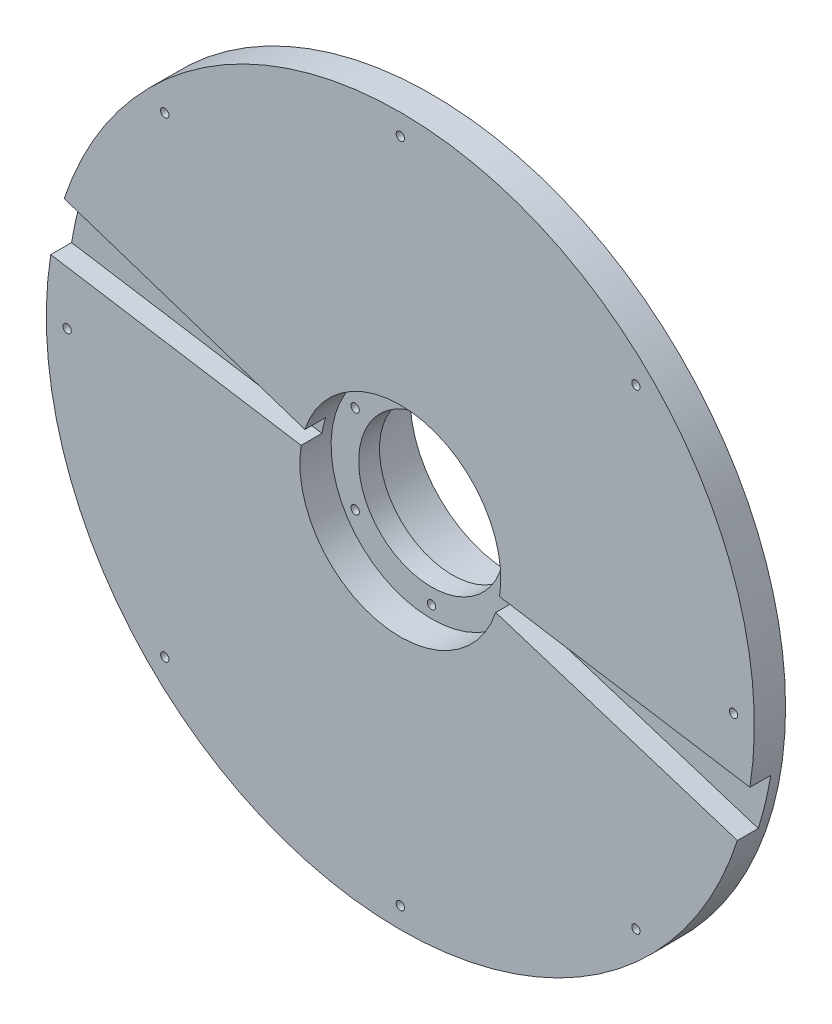
ISO-10303-21;
HEADER;
FILE_DESCRIPTION(('STEP AP214'),'2;1');
FILE_NAME('part.step','',(''),(''),'','','');
FILE_SCHEMA(('AUTOMOTIVE_DESIGN { 1 0 10303 214 1 1 1 1 }'));
ENDSEC;
DATA;
#1=APPLICATION_CONTEXT('core data for automotive mechanical design processes');
#2=APPLICATION_PROTOCOL_DEFINITION('international standard','automotive_design',2000,#1);
#3=PRODUCT_CONTEXT('',#1,'mechanical');
#4=PRODUCT('Part','Part','',(#3));
#5=PRODUCT_RELATED_PRODUCT_CATEGORY('part','',(#4));
#6=PRODUCT_DEFINITION_FORMATION('','',#4);
#7=PRODUCT_DEFINITION_CONTEXT('part definition',#1,'design');
#8=PRODUCT_DEFINITION('design','',#6,#7);
#9=PRODUCT_DEFINITION_SHAPE('','',#8);
#10=(LENGTH_UNIT() NAMED_UNIT(*) SI_UNIT(.MILLI.,.METRE.));
#11=(NAMED_UNIT(*) PLANE_ANGLE_UNIT() SI_UNIT($,.RADIAN.));
#12=(NAMED_UNIT(*) SI_UNIT($,.STERADIAN.) SOLID_ANGLE_UNIT());
#13=UNCERTAINTY_MEASURE_WITH_UNIT(LENGTH_MEASURE(1.E-05),#10,'distance_accuracy_value','');
#14=(GEOMETRIC_REPRESENTATION_CONTEXT(3) GLOBAL_UNCERTAINTY_ASSIGNED_CONTEXT((#13)) GLOBAL_UNIT_ASSIGNED_CONTEXT((#10,
#11,#12)) REPRESENTATION_CONTEXT('',''));
#15=CARTESIAN_POINT('',(0.,0.,0.));
#16=DIRECTION('',(0.,0.,1.));
#17=DIRECTION('',(1.,0.,0.));
#18=AXIS2_PLACEMENT_3D('',#15,#16,#17);
#19=CARTESIAN_POINT('',(0.,0.,53.));
#20=DIRECTION('',(0.,0.,1.));
#21=DIRECTION('',(1.,0.,0.));
#22=AXIS2_PLACEMENT_3D('',#19,#20,#21);
#23=PLANE('',#22);
#24=DIRECTION('',(-0.987467828834262,0.157820426489564,0.));
#25=VECTOR('',#24,1.);
#26=CARTESIAN_POINT('',(47.6453227412532,-7.61483557812152,53.));
#27=LINE('',#26,#25);
#28=CARTESIAN_POINT('',(167.869530901825,-26.8294725032259,53.));
#29=VERTEX_POINT('',#28);
#30=CARTESIAN_POINT('',(47.6453227412532,-7.61483557812152,53.));
#31=VERTEX_POINT('',#30);
#32=EDGE_CURVE('E128',#29,#31,#27,.T.);
#33=ORIENTED_EDGE('',*,*,#32,.F.);
#34=CARTESIAN_POINT('',(0.,0.,53.));
#35=DIRECTION('',(0.,0.,1.));
#36=DIRECTION('',(1.,0.,0.));
#37=AXIS2_PLACEMENT_3D('',#34,#35,#36);
#38=CIRCLE('',#37,170.);
#39=CARTESIAN_POINT('',(-161.405592188564,53.3688561827877,53.));
#40=VERTEX_POINT('',#39);
#41=EDGE_CURVE('E250',#29,#40,#38,.T.);
#42=ORIENTED_EDGE('',*,*,#41,.T.);
#43=DIRECTION('',(-0.949444659932734,0.313934448134027,0.));
#44=VECTOR('',#43,1.);
#45=CARTESIAN_POINT('',(-45.8107048417534,15.1473371224699,53.));
#46=LINE('',#45,#44);
#47=CARTESIAN_POINT('',(-45.8107048417534,15.1473371224699,53.));
#48=VERTEX_POINT('',#47);
#49=EDGE_CURVE('E161',#48,#40,#46,.T.);
#50=ORIENTED_EDGE('',*,*,#49,.F.);
#51=CARTESIAN_POINT('',(0.,0.,53.));
#52=DIRECTION('',(0.,0.,1.));
#53=DIRECTION('',(1.,0.,0.));
#54=AXIS2_PLACEMENT_3D('',#51,#52,#53);
#55=CIRCLE('',#54,48.25);
#56=EDGE_CURVE('E243',#31,#48,#55,.T.);
#57=ORIENTED_EDGE('',*,*,#56,.F.);
#58=EDGE_LOOP('',(#33,#42,#50,#57));
#59=FACE_BOUND('',#58,.T.);
#60=CARTESIAN_POINT('',(0.,160.,53.));
#61=DIRECTION('',(0.,0.,-1.));
#62=DIRECTION('',(-1.,0.,0.));
#63=AXIS2_PLACEMENT_3D('',#60,#61,#62);
#64=CIRCLE('',#63,2.);
#65=CARTESIAN_POINT('',(-2.,160.,53.));
#66=VERTEX_POINT('',#65);
#67=EDGE_CURVE('E235',#66,#66,#64,.T.);
#68=ORIENTED_EDGE('',*,*,#67,.T.);
#69=EDGE_LOOP('',(#68));
#70=FACE_BOUND('',#69,.T.);
#71=CARTESIAN_POINT('',(-113.137084989848,113.137084989847,53.));
#72=DIRECTION('',(0.,0.,-1.));
#73=DIRECTION('',(-0.707106781186546,-0.707106781186549,0.));
#74=AXIS2_PLACEMENT_3D('',#71,#72,#73);
#75=CIRCLE('',#74,2.);
#76=CARTESIAN_POINT('',(-114.551298552221,111.722871427474,53.));
#77=VERTEX_POINT('',#76);
#78=EDGE_CURVE('E227',#77,#77,#75,.T.);
#79=ORIENTED_EDGE('',*,*,#78,.T.);
#80=EDGE_LOOP('',(#79));
#81=FACE_BOUND('',#80,.T.);
#82=CARTESIAN_POINT('',(113.137084989846,113.137084989849,53.));
#83=DIRECTION('',(0.,0.,-1.));
#84=DIRECTION('',(-0.707106781186556,0.707106781186539,0.));
#85=AXIS2_PLACEMENT_3D('',#82,#83,#84);
#86=CIRCLE('',#85,2.);
#87=CARTESIAN_POINT('',(111.722871427473,114.551298552222,53.));
#88=VERTEX_POINT('',#87);
#89=EDGE_CURVE('E186',#88,#88,#86,.T.);
#90=ORIENTED_EDGE('',*,*,#89,.T.);
#91=EDGE_LOOP('',(#90));
#92=FACE_BOUND('',#91,.T.);
#93=CARTESIAN_POINT('',(160.,1.6759110426447E-12,53.));
#94=DIRECTION('',(0.,0.,-1.));
#95=DIRECTION('',(0.,1.,0.));
#96=AXIS2_PLACEMENT_3D('',#93,#94,#95);
#97=CIRCLE('',#96,2.);
#98=CARTESIAN_POINT('',(160.,2.00000000000168,53.));
#99=VERTEX_POINT('',#98);
#100=EDGE_CURVE('E177',#99,#99,#97,.T.);
#101=ORIENTED_EDGE('',*,*,#100,.T.);
#102=EDGE_LOOP('',(#101));
#103=FACE_BOUND('',#102,.T.);
#104=ADVANCED_FACE('F42',(#59,#70,#81,#92,#103),#23,.T.);
#105=CARTESIAN_POINT('',(0.,0.,38.));
#106=DIRECTION('',(0.,0.,1.));
#107=DIRECTION('',(1.,0.,0.));
#108=AXIS2_PLACEMENT_3D('',#105,#106,#107);
#109=PLANE('',#108);
#110=CARTESIAN_POINT('',(0.,0.,38.));
#111=DIRECTION('',(0.,0.,1.));
#112=DIRECTION('',(1.,0.,0.));
#113=AXIS2_PLACEMENT_3D('',#110,#111,#112);
#114=CIRCLE('',#113,35.);
#115=CARTESIAN_POINT('',(35.,0.,38.));
#116=VERTEX_POINT('',#115);
#117=EDGE_CURVE('E285',#116,#116,#114,.T.);
#118=ORIENTED_EDGE('',*,*,#117,.F.);
#119=EDGE_LOOP('',(#118));
#120=FACE_BOUND('',#119,.T.);
#121=CARTESIAN_POINT('',(0.,42.3567380238423,38.));
#122=DIRECTION('',(0.,0.,1.));
#123=DIRECTION('',(1.,0.,0.));
#124=AXIS2_PLACEMENT_3D('',#121,#122,#123);
#125=CIRCLE('',#124,2.);
#126=CARTESIAN_POINT('',(2.,42.3567380238423,38.));
#127=VERTEX_POINT('',#126);
#128=EDGE_CURVE('E280',#127,#127,#125,.T.);
#129=ORIENTED_EDGE('',*,*,#128,.F.);
#130=EDGE_LOOP('',(#129));
#131=FACE_BOUND('',#130,.T.);
#132=CARTESIAN_POINT('',(-36.6820111500898,21.1783690119211,38.));
#133=DIRECTION('',(0.,0.,1.));
#134=DIRECTION('',(0.499999999999998,0.86602540378444,0.));
#135=AXIS2_PLACEMENT_3D('',#132,#133,#134);
#136=CIRCLE('',#135,2.);
#137=CARTESIAN_POINT('',(-35.6820111500898,22.91041981949,38.));
#138=VERTEX_POINT('',#137);
#139=EDGE_CURVE('E263',#138,#138,#136,.T.);
#140=ORIENTED_EDGE('',*,*,#139,.F.);
#141=EDGE_LOOP('',(#140));
#142=FACE_BOUND('',#141,.T.);
#143=CARTESIAN_POINT('',(-36.6820111500896,-21.1783690119213,38.));
#144=DIRECTION('',(0.,0.,1.));
#145=DIRECTION('',(-0.500000000000004,0.866025403784436,0.));
#146=AXIS2_PLACEMENT_3D('',#143,#144,#145);
#147=CIRCLE('',#146,2.);
#148=CARTESIAN_POINT('',(-37.6820111500896,-19.4463182043525,38.));
#149=VERTEX_POINT('',#148);
#150=EDGE_CURVE('E259',#149,#149,#147,.T.);
#151=ORIENTED_EDGE('',*,*,#150,.F.);
#152=EDGE_LOOP('',(#151));
#153=FACE_BOUND('',#152,.T.);
#154=CARTESIAN_POINT('',(0.,-42.3567380238423,38.));
#155=DIRECTION('',(0.,0.,1.));
#156=DIRECTION('',(-1.,0.,0.));
#157=AXIS2_PLACEMENT_3D('',#154,#155,#156);
#158=CIRCLE('',#157,2.);
#159=CARTESIAN_POINT('',(-2.,-42.3567380238423,38.));
#160=VERTEX_POINT('',#159);
#161=EDGE_CURVE('E264',#160,#160,#158,.T.);
#162=ORIENTED_EDGE('',*,*,#161,.F.);
#163=EDGE_LOOP('',(#162));
#164=FACE_BOUND('',#163,.T.);
#165=CARTESIAN_POINT('',(36.6820111500899,-21.1783690119208,38.));
#166=DIRECTION('',(0.,0.,1.));
#167=DIRECTION('',(-0.499999999999992,-0.866025403784443,0.));
#168=AXIS2_PLACEMENT_3D('',#165,#166,#167);
#169=CIRCLE('',#168,2.);
#170=CARTESIAN_POINT('',(35.6820111500899,-22.9104198194897,38.));
#171=VERTEX_POINT('',#170);
#172=EDGE_CURVE('E268',#171,#171,#169,.T.);
#173=ORIENTED_EDGE('',*,*,#172,.F.);
#174=EDGE_LOOP('',(#173));
#175=FACE_BOUND('',#174,.T.);
#176=CARTESIAN_POINT('',(36.6820111500895,21.1783690119216,38.));
#177=DIRECTION('',(0.,0.,1.));
#178=DIRECTION('',(0.50000000000001,-0.866025403784433,0.));
#179=AXIS2_PLACEMENT_3D('',#176,#177,#178);
#180=CIRCLE('',#179,2.);
#181=CARTESIAN_POINT('',(37.6820111500895,19.4463182043527,38.));
#182=VERTEX_POINT('',#181);
#183=EDGE_CURVE('E272',#182,#182,#180,.T.);
#184=ORIENTED_EDGE('',*,*,#183,.F.);
#185=EDGE_LOOP('',(#184));
#186=FACE_BOUND('',#185,.T.);
#187=CARTESIAN_POINT('',(0.,0.,38.));
#188=DIRECTION('',(0.,0.,1.));
#189=DIRECTION('',(1.,0.,0.));
#190=AXIS2_PLACEMENT_3D('',#187,#188,#189);
#191=CIRCLE('',#190,48.25);
#192=CARTESIAN_POINT('',(48.25,0.,38.));
#193=VERTEX_POINT('',#192);
#194=EDGE_CURVE('E239',#193,#193,#191,.T.);
#195=ORIENTED_EDGE('',*,*,#194,.T.);
#196=EDGE_LOOP('',(#195));
#197=FACE_BOUND('',#196,.T.);
#198=ADVANCED_FACE('F355',(#120,#131,#142,#153,#164,#175,#186,#197),#109,.T.);
#199=CARTESIAN_POINT('',(0.,0.,28.));
#200=DIRECTION('',(0.,0.,-1.));
#201=DIRECTION('',(-1.,0.,0.));
#202=AXIS2_PLACEMENT_3D('',#199,#200,#201);
#203=CYLINDRICAL_SURFACE('',#202,60.);
#204=CARTESIAN_POINT('',(0.,0.,28.));
#205=DIRECTION('',(0.,0.,1.));
#206=DIRECTION('',(1.,0.,0.));
#207=AXIS2_PLACEMENT_3D('',#204,#205,#206);
#208=CIRCLE('',#207,60.);
#209=CARTESIAN_POINT('',(60.,0.,28.));
#210=VERTEX_POINT('',#209);
#211=EDGE_CURVE('E11',#210,#210,#208,.T.);
#212=ORIENTED_EDGE('',*,*,#211,.F.);
#213=EDGE_LOOP('',(#212));
#214=FACE_BOUND('',#213,.T.);
#215=CARTESIAN_POINT('',(0.,0.,0.));
#216=DIRECTION('',(0.,0.,1.));
#217=DIRECTION('',(1.,0.,0.));
#218=AXIS2_PLACEMENT_3D('',#215,#216,#217);
#219=CIRCLE('',#218,60.);
#220=CARTESIAN_POINT('',(60.,0.,0.));
#221=VERTEX_POINT('',#220);
#222=EDGE_CURVE('E52',#221,#221,#219,.T.);
#223=ORIENTED_EDGE('',*,*,#222,.T.);
#224=EDGE_LOOP('',(#223));
#225=FACE_BOUND('',#224,.T.);
#226=ADVANCED_FACE('F44',(#214,#225),#203,.T.);
#227=CARTESIAN_POINT('',(0.,0.,0.));
#228=DIRECTION('',(0.,0.,1.));
#229=DIRECTION('',(1.,0.,0.));
#230=AXIS2_PLACEMENT_3D('',#227,#228,#229);
#231=PLANE('',#230);
#232=CARTESIAN_POINT('',(0.,0.,0.));
#233=DIRECTION('',(0.,0.,1.));
#234=DIRECTION('',(1.,0.,0.));
#235=AXIS2_PLACEMENT_3D('',#232,#233,#234);
#236=CIRCLE('',#235,48.25);
#237=CARTESIAN_POINT('',(48.25,0.,0.));
#238=VERTEX_POINT('',#237);
#239=EDGE_CURVE('E299',#238,#238,#236,.T.);
#240=ORIENTED_EDGE('',*,*,#239,.T.);
#241=EDGE_LOOP('',(#240));
#242=FACE_BOUND('',#241,.T.);
#243=ORIENTED_EDGE('',*,*,#222,.F.);
#244=EDGE_LOOP('',(#243));
#245=FACE_BOUND('',#244,.T.);
#246=ADVANCED_FACE('F420',(#242,#245),#231,.F.);
#247=CARTESIAN_POINT('',(0.,0.,0.));
#248=DIRECTION('',(0.,0.,1.));
#249=DIRECTION('',(1.,0.,0.));
#250=AXIS2_PLACEMENT_3D('',#247,#248,#249);
#251=CYLINDRICAL_SURFACE('',#250,48.25);
#252=ORIENTED_EDGE('',*,*,#239,.F.);
#253=EDGE_LOOP('',(#252));
#254=FACE_BOUND('',#253,.T.);
#255=CARTESIAN_POINT('',(0.,0.,28.));
#256=DIRECTION('',(0.,0.,1.));
#257=DIRECTION('',(1.,0.,0.));
#258=AXIS2_PLACEMENT_3D('',#255,#256,#257);
#259=CIRCLE('',#258,48.25);
#260=CARTESIAN_POINT('',(48.25,0.,28.));
#261=VERTEX_POINT('',#260);
#262=EDGE_CURVE('E294',#261,#261,#259,.T.);
#263=ORIENTED_EDGE('',*,*,#262,.T.);
#264=EDGE_LOOP('',(#263));
#265=FACE_BOUND('',#264,.T.);
#266=ADVANCED_FACE('F414',(#254,#265),#251,.F.);
#267=CARTESIAN_POINT('',(0.,0.,28.));
#268=DIRECTION('',(0.,0.,1.));
#269=DIRECTION('',(1.,0.,0.));
#270=AXIS2_PLACEMENT_3D('',#267,#268,#269);
#271=PLANE('',#270);
#272=ORIENTED_EDGE('',*,*,#211,.T.);
#273=EDGE_LOOP('',(#272));
#274=FACE_BOUND('',#273,.T.);
#275=CARTESIAN_POINT('',(0.,0.,28.));
#276=DIRECTION('',(0.,0.,1.));
#277=DIRECTION('',(1.,0.,0.));
#278=AXIS2_PLACEMENT_3D('',#275,#276,#277);
#279=CIRCLE('',#278,150.);
#280=CARTESIAN_POINT('',(150.,0.,28.));
#281=VERTEX_POINT('',#280);
#282=EDGE_CURVE('E295',#281,#281,#279,.T.);
#283=ORIENTED_EDGE('',*,*,#282,.F.);
#284=EDGE_LOOP('',(#283));
#285=FACE_BOUND('',#284,.T.);
#286=ADVANCED_FACE('F409',(#274,#285),#271,.F.);
#287=CARTESIAN_POINT('',(0.,0.,38.));
#288=DIRECTION('',(0.,0.,-1.));
#289=DIRECTION('',(-1.,0.,0.));
#290=AXIS2_PLACEMENT_3D('',#287,#288,#289);
#291=CYLINDRICAL_SURFACE('',#290,150.);
#292=CARTESIAN_POINT('',(0.,0.,38.));
#293=DIRECTION('',(0.,0.,1.));
#294=DIRECTION('',(1.,0.,0.));
#295=AXIS2_PLACEMENT_3D('',#292,#293,#294);
#296=CIRCLE('',#295,150.);
#297=CARTESIAN_POINT('',(150.,0.,38.));
#298=VERTEX_POINT('',#297);
#299=EDGE_CURVE('E290',#298,#298,#296,.T.);
#300=ORIENTED_EDGE('',*,*,#299,.F.);
#301=EDGE_LOOP('',(#300));
#302=FACE_BOUND('',#301,.T.);
#303=ORIENTED_EDGE('',*,*,#282,.T.);
#304=EDGE_LOOP('',(#303));
#305=FACE_BOUND('',#304,.T.);
#306=ADVANCED_FACE('F406',(#302,#305),#291,.T.);
#307=CARTESIAN_POINT('',(36.6820111500895,21.1783690119216,28.));
#308=DIRECTION('',(0.,0.,1.));
#309=DIRECTION('',(1.,0.,0.));
#310=AXIS2_PLACEMENT_3D('',#307,#308,#309);
#311=CIRCLE('',#310,2.);
#312=CARTESIAN_POINT('',(38.6820111500895,21.1783690119216,28.));
#313=VERTEX_POINT('',#312);
#314=EDGE_CURVE('E46',#313,#313,#311,.T.);
#315=ORIENTED_EDGE('',*,*,#314,.T.);
#316=EDGE_LOOP('',(#315));
#317=FACE_BOUND('',#316,.T.);
#318=CARTESIAN_POINT('',(36.6820111500899,-21.1783690119208,28.));
#319=DIRECTION('',(0.,0.,1.));
#320=DIRECTION('',(1.,0.,0.));
#321=AXIS2_PLACEMENT_3D('',#318,#319,#320);
#322=CIRCLE('',#321,2.);
#323=CARTESIAN_POINT('',(38.6820111500899,-21.1783690119208,28.));
#324=VERTEX_POINT('',#323);
#325=EDGE_CURVE('E325',#324,#324,#322,.T.);
#326=ORIENTED_EDGE('',*,*,#325,.T.);
#327=EDGE_LOOP('',(#326));
#328=FACE_BOUND('',#327,.T.);
#329=CARTESIAN_POINT('',(0.,-42.3567380238423,28.));
#330=DIRECTION('',(0.,0.,1.));
#331=DIRECTION('',(1.,0.,0.));
#332=AXIS2_PLACEMENT_3D('',#329,#330,#331);
#333=CIRCLE('',#332,2.);
#334=CARTESIAN_POINT('',(2.,-42.3567380238423,28.));
#335=VERTEX_POINT('',#334);
#336=EDGE_CURVE('E322',#335,#335,#333,.T.);
#337=ORIENTED_EDGE('',*,*,#336,.T.);
#338=EDGE_LOOP('',(#337));
#339=FACE_BOUND('',#338,.T.);
#340=CARTESIAN_POINT('',(-36.6820111500896,-21.1783690119213,28.));
#341=DIRECTION('',(0.,0.,1.));
#342=DIRECTION('',(1.,0.,0.));
#343=AXIS2_PLACEMENT_3D('',#340,#341,#342);
#344=CIRCLE('',#343,2.);
#345=CARTESIAN_POINT('',(-34.6820111500896,-21.1783690119213,28.));
#346=VERTEX_POINT('',#345);
#347=EDGE_CURVE('E318',#346,#346,#344,.T.);
#348=ORIENTED_EDGE('',*,*,#347,.T.);
#349=EDGE_LOOP('',(#348));
#350=FACE_BOUND('',#349,.T.);
#351=CARTESIAN_POINT('',(-36.6820111500898,21.1783690119211,28.));
#352=DIRECTION('',(0.,0.,1.));
#353=DIRECTION('',(1.,0.,0.));
#354=AXIS2_PLACEMENT_3D('',#351,#352,#353);
#355=CIRCLE('',#354,2.);
#356=CARTESIAN_POINT('',(-34.6820111500898,21.1783690119211,28.));
#357=VERTEX_POINT('',#356);
#358=EDGE_CURVE('E279',#357,#357,#355,.T.);
#359=ORIENTED_EDGE('',*,*,#358,.T.);
#360=EDGE_LOOP('',(#359));
#361=FACE_BOUND('',#360,.T.);
#362=CARTESIAN_POINT('',(0.,42.3567380238423,28.));
#363=DIRECTION('',(0.,0.,1.));
#364=DIRECTION('',(1.,0.,0.));
#365=AXIS2_PLACEMENT_3D('',#362,#363,#364);
#366=CIRCLE('',#365,2.);
#367=CARTESIAN_POINT('',(2.,42.3567380238423,28.));
#368=VERTEX_POINT('',#367);
#369=EDGE_CURVE('E284',#368,#368,#366,.T.);
#370=ORIENTED_EDGE('',*,*,#369,.T.);
#371=EDGE_LOOP('',(#370));
#372=FACE_BOUND('',#371,.T.);
#373=CARTESIAN_POINT('',(0.,0.,28.));
#374=DIRECTION('',(0.,0.,1.));
#375=DIRECTION('',(1.,0.,0.));
#376=AXIS2_PLACEMENT_3D('',#373,#374,#375);
#377=CIRCLE('',#376,35.);
#378=CARTESIAN_POINT('',(35.,0.,28.));
#379=VERTEX_POINT('',#378);
#380=EDGE_CURVE('E289',#379,#379,#377,.T.);
#381=ORIENTED_EDGE('',*,*,#380,.T.);
#382=EDGE_LOOP('',(#381));
#383=FACE_BOUND('',#382,.T.);
#384=ORIENTED_EDGE('',*,*,#262,.F.);
#385=EDGE_LOOP('',(#384));
#386=FACE_BOUND('',#385,.T.);
#387=ADVANCED_FACE('F334',(#317,#328,#339,#350,#361,#372,#383,#386),#271,.F.);
#388=CARTESIAN_POINT('',(0.,0.,0.));
#389=DIRECTION('',(0.,0.,1.));
#390=DIRECTION('',(1.,0.,0.));
#391=AXIS2_PLACEMENT_3D('',#388,#389,#390);
#392=CYLINDRICAL_SURFACE('',#391,35.);
#393=ORIENTED_EDGE('',*,*,#117,.T.);
#394=EDGE_LOOP('',(#393));
#395=FACE_BOUND('',#394,.T.);
#396=ORIENTED_EDGE('',*,*,#380,.F.);
#397=EDGE_LOOP('',(#396));
#398=FACE_BOUND('',#397,.T.);
#399=ADVANCED_FACE('F424',(#395,#398),#392,.F.);
#400=CARTESIAN_POINT('',(0.,42.3567380238423,0.));
#401=DIRECTION('',(0.,0.,1.));
#402=DIRECTION('',(1.,0.,0.));
#403=AXIS2_PLACEMENT_3D('',#400,#401,#402);
#404=CYLINDRICAL_SURFACE('',#403,2.);
#405=ORIENTED_EDGE('',*,*,#128,.T.);
#406=EDGE_LOOP('',(#405));
#407=FACE_BOUND('',#406,.T.);
#408=ORIENTED_EDGE('',*,*,#369,.F.);
#409=EDGE_LOOP('',(#408));
#410=FACE_BOUND('',#409,.T.);
#411=ADVANCED_FACE('F428',(#407,#410),#404,.F.);
#412=CARTESIAN_POINT('',(-36.6820111500898,21.1783690119211,0.));
#413=DIRECTION('',(0.,0.,1.));
#414=DIRECTION('',(1.,0.,0.));
#415=AXIS2_PLACEMENT_3D('',#412,#413,#414);
#416=CYLINDRICAL_SURFACE('',#415,2.);
#417=ORIENTED_EDGE('',*,*,#139,.T.);
#418=EDGE_LOOP('',(#417));
#419=FACE_BOUND('',#418,.T.);
#420=ORIENTED_EDGE('',*,*,#358,.F.);
#421=EDGE_LOOP('',(#420));
#422=FACE_BOUND('',#421,.T.);
#423=ADVANCED_FACE('F434',(#419,#422),#416,.F.);
#424=CARTESIAN_POINT('',(-36.6820111500896,-21.1783690119213,0.));
#425=DIRECTION('',(0.,0.,1.));
#426=DIRECTION('',(1.,0.,0.));
#427=AXIS2_PLACEMENT_3D('',#424,#425,#426);
#428=CYLINDRICAL_SURFACE('',#427,2.);
#429=ORIENTED_EDGE('',*,*,#150,.T.);
#430=EDGE_LOOP('',(#429));
#431=FACE_BOUND('',#430,.T.);
#432=ORIENTED_EDGE('',*,*,#347,.F.);
#433=EDGE_LOOP('',(#432));
#434=FACE_BOUND('',#433,.T.);
#435=ADVANCED_FACE('F439',(#431,#434),#428,.F.);
#436=CARTESIAN_POINT('',(0.,-42.3567380238423,0.));
#437=DIRECTION('',(0.,0.,1.));
#438=DIRECTION('',(1.,0.,0.));
#439=AXIS2_PLACEMENT_3D('',#436,#437,#438);
#440=CYLINDRICAL_SURFACE('',#439,2.);
#441=ORIENTED_EDGE('',*,*,#161,.T.);
#442=EDGE_LOOP('',(#441));
#443=FACE_BOUND('',#442,.T.);
#444=ORIENTED_EDGE('',*,*,#336,.F.);
#445=EDGE_LOOP('',(#444));
#446=FACE_BOUND('',#445,.T.);
#447=ADVANCED_FACE('F350',(#443,#446),#440,.F.);
#448=CARTESIAN_POINT('',(36.6820111500899,-21.1783690119208,0.));
#449=DIRECTION('',(0.,0.,1.));
#450=DIRECTION('',(1.,0.,0.));
#451=AXIS2_PLACEMENT_3D('',#448,#449,#450);
#452=CYLINDRICAL_SURFACE('',#451,2.);
#453=ORIENTED_EDGE('',*,*,#172,.T.);
#454=EDGE_LOOP('',(#453));
#455=FACE_BOUND('',#454,.T.);
#456=ORIENTED_EDGE('',*,*,#325,.F.);
#457=EDGE_LOOP('',(#456));
#458=FACE_BOUND('',#457,.T.);
#459=ADVANCED_FACE('F339',(#455,#458),#452,.F.);
#460=CARTESIAN_POINT('',(36.6820111500895,21.1783690119216,0.));
#461=DIRECTION('',(0.,0.,1.));
#462=DIRECTION('',(1.,0.,0.));
#463=AXIS2_PLACEMENT_3D('',#460,#461,#462);
#464=CYLINDRICAL_SURFACE('',#463,2.);
#465=ORIENTED_EDGE('',*,*,#183,.T.);
#466=EDGE_LOOP('',(#465));
#467=FACE_BOUND('',#466,.T.);
#468=ORIENTED_EDGE('',*,*,#314,.F.);
#469=EDGE_LOOP('',(#468));
#470=FACE_BOUND('',#469,.T.);
#471=ADVANCED_FACE('F336',(#467,#470),#464,.F.);
#472=CARTESIAN_POINT('',(0.,0.,38.));
#473=DIRECTION('',(0.,0.,1.));
#474=DIRECTION('',(1.,0.,0.));
#475=AXIS2_PLACEMENT_3D('',#472,#473,#474);
#476=PLANE('',#475);
#477=CARTESIAN_POINT('',(-160.,-5.58637014214902E-13,38.));
#478=DIRECTION('',(0.,0.,-1.));
#479=DIRECTION('',(0.,-1.,0.));
#480=AXIS2_PLACEMENT_3D('',#477,#478,#479);
#481=CIRCLE('',#480,2.);
#482=CARTESIAN_POINT('',(-160.,-2.00000000000056,38.));
#483=VERTEX_POINT('',#482);
#484=EDGE_CURVE('E200',#483,#483,#481,.T.);
#485=ORIENTED_EDGE('',*,*,#484,.F.);
#486=EDGE_LOOP('',(#485));
#487=FACE_BOUND('',#486,.T.);
#488=CARTESIAN_POINT('',(-113.137084989847,-113.137084989848,38.));
#489=DIRECTION('',(0.,0.,-1.));
#490=DIRECTION('',(0.707106781186551,-0.707106781186544,0.));
#491=AXIS2_PLACEMENT_3D('',#488,#489,#490);
#492=CIRCLE('',#491,2.);
#493=CARTESIAN_POINT('',(-111.722871427474,-114.551298552221,38.));
#494=VERTEX_POINT('',#493);
#495=EDGE_CURVE('E208',#494,#494,#492,.T.);
#496=ORIENTED_EDGE('',*,*,#495,.F.);
#497=EDGE_LOOP('',(#496));
#498=FACE_BOUND('',#497,.T.);
#499=CARTESIAN_POINT('',(0.,-160.,38.));
#500=DIRECTION('',(0.,0.,-1.));
#501=DIRECTION('',(1.,0.,0.));
#502=AXIS2_PLACEMENT_3D('',#499,#500,#501);
#503=CIRCLE('',#502,2.);
#504=CARTESIAN_POINT('',(2.,-160.,38.));
#505=VERTEX_POINT('',#504);
#506=EDGE_CURVE('E216',#505,#505,#503,.T.);
#507=ORIENTED_EDGE('',*,*,#506,.F.);
#508=EDGE_LOOP('',(#507));
#509=FACE_BOUND('',#508,.T.);
#510=CARTESIAN_POINT('',(113.137084989849,-113.137084989847,38.));
#511=DIRECTION('',(0.,0.,-1.));
#512=DIRECTION('',(0.707106781186541,0.707106781186554,0.));
#513=AXIS2_PLACEMENT_3D('',#510,#511,#512);
#514=CIRCLE('',#513,2.);
#515=CARTESIAN_POINT('',(114.551298552222,-111.722871427474,38.));
#516=VERTEX_POINT('',#515);
#517=EDGE_CURVE('E181',#516,#516,#514,.T.);
#518=ORIENTED_EDGE('',*,*,#517,.F.);
#519=EDGE_LOOP('',(#518));
#520=FACE_BOUND('',#519,.T.);
#521=CARTESIAN_POINT('',(160.,1.6759110426447E-12,38.));
#522=DIRECTION('',(0.,0.,-1.));
#523=DIRECTION('',(0.,1.,0.));
#524=AXIS2_PLACEMENT_3D('',#521,#522,#523);
#525=CIRCLE('',#524,2.);
#526=CARTESIAN_POINT('',(160.,2.00000000000168,38.));
#527=VERTEX_POINT('',#526);
#528=EDGE_CURVE('E182',#527,#527,#525,.T.);
#529=ORIENTED_EDGE('',*,*,#528,.F.);
#530=EDGE_LOOP('',(#529));
#531=FACE_BOUND('',#530,.T.);
#532=CARTESIAN_POINT('',(113.137084989846,113.137084989849,38.));
#533=DIRECTION('',(0.,0.,-1.));
#534=DIRECTION('',(-0.707106781186556,0.707106781186539,0.));
#535=AXIS2_PLACEMENT_3D('',#532,#533,#534);
#536=CIRCLE('',#535,2.);
#537=CARTESIAN_POINT('',(111.722871427473,114.551298552222,38.));
#538=VERTEX_POINT('',#537);
#539=EDGE_CURVE('E190',#538,#538,#536,.T.);
#540=ORIENTED_EDGE('',*,*,#539,.F.);
#541=EDGE_LOOP('',(#540));
#542=FACE_BOUND('',#541,.T.);
#543=CARTESIAN_POINT('',(-113.137084989848,113.137084989847,38.));
#544=DIRECTION('',(0.,0.,-1.));
#545=DIRECTION('',(-0.707106781186546,-0.707106781186549,0.));
#546=AXIS2_PLACEMENT_3D('',#543,#544,#545);
#547=CIRCLE('',#546,2.);
#548=CARTESIAN_POINT('',(-114.551298552221,111.722871427474,38.));
#549=VERTEX_POINT('',#548);
#550=EDGE_CURVE('E199',#549,#549,#547,.T.);
#551=ORIENTED_EDGE('',*,*,#550,.F.);
#552=EDGE_LOOP('',(#551));
#553=FACE_BOUND('',#552,.T.);
#554=CARTESIAN_POINT('',(0.,160.,38.));
#555=DIRECTION('',(0.,0.,-1.));
#556=DIRECTION('',(-1.,0.,0.));
#557=AXIS2_PLACEMENT_3D('',#554,#555,#556);
#558=CIRCLE('',#557,2.);
#559=CARTESIAN_POINT('',(-2.,160.,38.));
#560=VERTEX_POINT('',#559);
#561=EDGE_CURVE('E231',#560,#560,#558,.T.);
#562=ORIENTED_EDGE('',*,*,#561,.F.);
#563=EDGE_LOOP('',(#562));
#564=FACE_BOUND('',#563,.T.);
#565=CARTESIAN_POINT('',(0.,0.,38.));
#566=DIRECTION('',(0.,0.,1.));
#567=DIRECTION('',(1.,0.,0.));
#568=AXIS2_PLACEMENT_3D('',#565,#566,#567);
#569=CIRCLE('',#568,170.);
#570=CARTESIAN_POINT('',(170.,0.,38.));
#571=VERTEX_POINT('',#570);
#572=EDGE_CURVE('E255',#571,#571,#569,.T.);
#573=ORIENTED_EDGE('',*,*,#572,.F.);
#574=EDGE_LOOP('',(#573));
#575=FACE_BOUND('',#574,.T.);
#576=ORIENTED_EDGE('',*,*,#299,.T.);
#577=EDGE_LOOP('',(#576));
#578=FACE_BOUND('',#577,.T.);
#579=ADVANCED_FACE('F338',(#487,#498,#509,#520,#531,#542,#553,#564,#575,#578),#476,.F.);
#580=DIRECTION('',(0.953228891291381,-0.302249368580654,0.));
#581=VECTOR('',#580,1.);
#582=CARTESIAN_POINT('',(45.8107048417554,-15.1473371224636,53.));
#583=LINE('',#582,#581);
#584=CARTESIAN_POINT('',(45.8107048417554,-15.1473371224636,53.));
#585=VERTEX_POINT('',#584);
#586=CARTESIAN_POINT('',(161.868807027714,-51.9469855855443,53.));
#587=VERTEX_POINT('',#586);
#588=EDGE_CURVE('E165',#585,#587,#583,.T.);
#589=ORIENTED_EDGE('',*,*,#588,.F.);
#590=CARTESIAN_POINT('',(-47.6453227412542,7.61483557811496,53.));
#591=VERTEX_POINT('',#590);
#592=EDGE_CURVE('E135',#591,#585,#55,.T.);
#593=ORIENTED_EDGE('',*,*,#592,.F.);
#594=DIRECTION('',(0.987467828834273,-0.157820426489497,0.));
#595=VECTOR('',#594,1.);
#596=CARTESIAN_POINT('',(-47.6453227412542,7.61483557811496,53.));
#597=LINE('',#596,#595);
#598=CARTESIAN_POINT('',(-167.869530901827,26.8294725032112,53.));
#599=VERTEX_POINT('',#598);
#600=EDGE_CURVE('E158',#599,#591,#597,.T.);
#601=ORIENTED_EDGE('',*,*,#600,.F.);
#602=EDGE_CURVE('E254',#599,#587,#38,.T.);
#603=ORIENTED_EDGE('',*,*,#602,.T.);
#604=EDGE_LOOP('',(#589,#593,#601,#603));
#605=FACE_BOUND('',#604,.T.);
#606=CARTESIAN_POINT('',(-160.,-5.58637014214902E-13,53.));
#607=DIRECTION('',(0.,0.,-1.));
#608=DIRECTION('',(0.,-1.,0.));
#609=AXIS2_PLACEMENT_3D('',#606,#607,#608);
#610=CIRCLE('',#609,2.);
#611=CARTESIAN_POINT('',(-160.,-2.00000000000056,53.));
#612=VERTEX_POINT('',#611);
#613=EDGE_CURVE('E195',#612,#612,#610,.T.);
#614=ORIENTED_EDGE('',*,*,#613,.T.);
#615=EDGE_LOOP('',(#614));
#616=FACE_BOUND('',#615,.T.);
#617=CARTESIAN_POINT('',(-113.137084989847,-113.137084989848,53.));
#618=DIRECTION('',(0.,0.,-1.));
#619=DIRECTION('',(0.707106781186551,-0.707106781186544,0.));
#620=AXIS2_PLACEMENT_3D('',#617,#618,#619);
#621=CIRCLE('',#620,2.);
#622=CARTESIAN_POINT('',(-111.722871427474,-114.551298552221,53.));
#623=VERTEX_POINT('',#622);
#624=EDGE_CURVE('E204',#623,#623,#621,.T.);
#625=ORIENTED_EDGE('',*,*,#624,.T.);
#626=EDGE_LOOP('',(#625));
#627=FACE_BOUND('',#626,.T.);
#628=CARTESIAN_POINT('',(0.,-160.,53.));
#629=DIRECTION('',(0.,0.,-1.));
#630=DIRECTION('',(1.,0.,0.));
#631=AXIS2_PLACEMENT_3D('',#628,#629,#630);
#632=CIRCLE('',#631,2.);
#633=CARTESIAN_POINT('',(2.,-160.,53.));
#634=VERTEX_POINT('',#633);
#635=EDGE_CURVE('E212',#634,#634,#632,.T.);
#636=ORIENTED_EDGE('',*,*,#635,.T.);
#637=EDGE_LOOP('',(#636));
#638=FACE_BOUND('',#637,.T.);
#639=CARTESIAN_POINT('',(113.137084989849,-113.137084989847,53.));
#640=DIRECTION('',(0.,0.,-1.));
#641=DIRECTION('',(0.707106781186541,0.707106781186554,0.));
#642=AXIS2_PLACEMENT_3D('',#639,#640,#641);
#643=CIRCLE('',#642,2.);
#644=CARTESIAN_POINT('',(114.551298552222,-111.722871427474,53.));
#645=VERTEX_POINT('',#644);
#646=EDGE_CURVE('E220',#645,#645,#643,.T.);
#647=ORIENTED_EDGE('',*,*,#646,.T.);
#648=EDGE_LOOP('',(#647));
#649=FACE_BOUND('',#648,.T.);
#650=ADVANCED_FACE('F347',(#605,#616,#627,#638,#649),#23,.T.);
#651=CARTESIAN_POINT('',(0.,0.,53.));
#652=DIRECTION('',(0.,0.,-1.));
#653=DIRECTION('',(-1.,0.,0.));
#654=AXIS2_PLACEMENT_3D('',#651,#652,#653);
#655=CYLINDRICAL_SURFACE('',#654,170.);
#656=ORIENTED_EDGE('',*,*,#41,.F.);
#657=DIRECTION('',(0.,0.,1.));
#658=VECTOR('',#657,1.);
#659=CARTESIAN_POINT('',(167.869530901825,-26.8294725032259,43.));
#660=LINE('',#659,#658);
#661=CARTESIAN_POINT('',(167.869530901825,-26.8294725032259,43.));
#662=VERTEX_POINT('',#661);
#663=EDGE_CURVE('E140',#662,#29,#660,.T.);
#664=ORIENTED_EDGE('',*,*,#663,.F.);
#665=CARTESIAN_POINT('',(-1.33892896769794E-10,3.21062620933787E-11,43.));
#666=DIRECTION('',(0.,0.,1.));
#667=DIRECTION('',(-1.,0.,0.));
#668=AXIS2_PLACEMENT_3D('',#665,#666,#667);
#669=CIRCLE('',#668,170.000000000137);
#670=CARTESIAN_POINT('',(161.868807027714,-51.9469855855443,43.));
#671=VERTEX_POINT('',#670);
#672=EDGE_CURVE('E120',#671,#662,#669,.T.);
#673=ORIENTED_EDGE('',*,*,#672,.F.);
#674=DIRECTION('',(0.,0.,1.));
#675=VECTOR('',#674,1.);
#676=CARTESIAN_POINT('',(161.868807027714,-51.9469855855443,43.));
#677=LINE('',#676,#675);
#678=EDGE_CURVE('E117',#671,#587,#677,.T.);
#679=ORIENTED_EDGE('',*,*,#678,.T.);
#680=ORIENTED_EDGE('',*,*,#602,.F.);
#681=DIRECTION('',(0.,0.,1.));
#682=VECTOR('',#681,1.);
#683=CARTESIAN_POINT('',(-167.869530901827,26.8294725032112,43.));
#684=LINE('',#683,#682);
#685=CARTESIAN_POINT('',(-167.869530901827,26.8294725032112,43.));
#686=VERTEX_POINT('',#685);
#687=EDGE_CURVE('E152',#686,#599,#684,.T.);
#688=ORIENTED_EDGE('',*,*,#687,.F.);
#689=CARTESIAN_POINT('',(8.05189248609395E-11,-1.99007477164059E-11,43.));
#690=DIRECTION('',(0.,0.,1.));
#691=DIRECTION('',(1.,0.,0.));
#692=AXIS2_PLACEMENT_3D('',#689,#690,#691);
#693=CIRCLE('',#692,170.000000000083);
#694=CARTESIAN_POINT('',(-161.405592188564,53.3688561827877,43.));
#695=VERTEX_POINT('',#694);
#696=EDGE_CURVE('E168',#695,#686,#693,.T.);
#697=ORIENTED_EDGE('',*,*,#696,.F.);
#698=DIRECTION('',(0.,0.,1.));
#699=VECTOR('',#698,1.);
#700=CARTESIAN_POINT('',(-161.405592188564,53.3688561827877,43.));
#701=LINE('',#700,#699);
#702=EDGE_CURVE('E148',#695,#40,#701,.T.);
#703=ORIENTED_EDGE('',*,*,#702,.T.);
#704=EDGE_LOOP('',(#656,#664,#673,#679,#680,#688,#697,#703));
#705=FACE_BOUND('',#704,.T.);
#706=ORIENTED_EDGE('',*,*,#572,.T.);
#707=EDGE_LOOP('',(#706));
#708=FACE_BOUND('',#707,.T.);
#709=ADVANCED_FACE('F368',(#705,#708),#655,.T.);
#710=CARTESIAN_POINT('',(0.,0.,53.));
#711=DIRECTION('',(0.,0.,-1.));
#712=DIRECTION('',(-1.,0.,0.));
#713=AXIS2_PLACEMENT_3D('',#710,#711,#712);
#714=CYLINDRICAL_SURFACE('',#713,48.25);
#715=DIRECTION('',(0.,0.,1.));
#716=VECTOR('',#715,1.);
#717=CARTESIAN_POINT('',(47.6453227412532,-7.61483557812152,43.));
#718=LINE('',#717,#716);
#719=CARTESIAN_POINT('',(47.6453227412532,-7.61483557812152,43.));
#720=VERTEX_POINT('',#719);
#721=EDGE_CURVE('E194',#720,#31,#718,.T.);
#722=ORIENTED_EDGE('',*,*,#721,.T.);
#723=ORIENTED_EDGE('',*,*,#56,.T.);
#724=DIRECTION('',(0.,0.,1.));
#725=VECTOR('',#724,1.);
#726=CARTESIAN_POINT('',(-45.8107048417534,15.1473371224699,43.));
#727=LINE('',#726,#725);
#728=CARTESIAN_POINT('',(-45.8107048417534,15.1473371224699,43.));
#729=VERTEX_POINT('',#728);
#730=EDGE_CURVE('E145',#729,#48,#727,.T.);
#731=ORIENTED_EDGE('',*,*,#730,.F.);
#732=CARTESIAN_POINT('',(4.02039512792385E-11,-9.7387375941338E-12,43.));
#733=DIRECTION('',(0.,0.,-1.));
#734=DIRECTION('',(1.,0.,0.));
#735=AXIS2_PLACEMENT_3D('',#732,#733,#734);
#736=CIRCLE('',#735,48.2500000000412);
#737=CARTESIAN_POINT('',(-47.6453227412542,7.61483557811496,43.));
#738=VERTEX_POINT('',#737);
#739=EDGE_CURVE('E162',#738,#729,#736,.T.);
#740=ORIENTED_EDGE('',*,*,#739,.F.);
#741=DIRECTION('',(0.,0.,1.));
#742=VECTOR('',#741,1.);
#743=CARTESIAN_POINT('',(-47.6453227412542,7.61483557811496,43.));
#744=LINE('',#743,#742);
#745=EDGE_CURVE('E155',#738,#591,#744,.T.);
#746=ORIENTED_EDGE('',*,*,#745,.T.);
#747=ORIENTED_EDGE('',*,*,#592,.T.);
#748=DIRECTION('',(0.,0.,1.));
#749=VECTOR('',#748,1.);
#750=CARTESIAN_POINT('',(45.8107048417554,-15.1473371224636,43.));
#751=LINE('',#750,#749);
#752=CARTESIAN_POINT('',(45.8107048417554,-15.1473371224636,43.));
#753=VERTEX_POINT('',#752);
#754=EDGE_CURVE('E114',#753,#585,#751,.T.);
#755=ORIENTED_EDGE('',*,*,#754,.F.);
#756=CARTESIAN_POINT('',(-2.38489783477291E-11,5.67948466034807E-12,43.));
#757=DIRECTION('',(0.,0.,-1.));
#758=DIRECTION('',(-1.,0.,0.));
#759=AXIS2_PLACEMENT_3D('',#756,#757,#758);
#760=CIRCLE('',#759,48.2500000000244);
#761=EDGE_CURVE('E121',#720,#753,#760,.T.);
#762=ORIENTED_EDGE('',*,*,#761,.F.);
#763=EDGE_LOOP('',(#722,#723,#731,#740,#746,#747,#755,#762));
#764=FACE_BOUND('',#763,.T.);
#765=ORIENTED_EDGE('',*,*,#194,.F.);
#766=EDGE_LOOP('',(#765));
#767=FACE_BOUND('',#766,.T.);
#768=ADVANCED_FACE('F131',(#764,#767),#714,.F.);
#769=CARTESIAN_POINT('',(0.,160.,53.));
#770=DIRECTION('',(0.,0.,-1.));
#771=DIRECTION('',(-1.,0.,0.));
#772=AXIS2_PLACEMENT_3D('',#769,#770,#771);
#773=CYLINDRICAL_SURFACE('',#772,2.);
#774=ORIENTED_EDGE('',*,*,#67,.F.);
#775=EDGE_LOOP('',(#774));
#776=FACE_BOUND('',#775,.T.);
#777=ORIENTED_EDGE('',*,*,#561,.T.);
#778=EDGE_LOOP('',(#777));
#779=FACE_BOUND('',#778,.T.);
#780=ADVANCED_FACE('F470',(#776,#779),#773,.F.);
#781=CARTESIAN_POINT('',(-113.137084989848,113.137084989847,53.));
#782=DIRECTION('',(0.,0.,-1.));
#783=DIRECTION('',(-1.,0.,0.));
#784=AXIS2_PLACEMENT_3D('',#781,#782,#783);
#785=CYLINDRICAL_SURFACE('',#784,2.);
#786=ORIENTED_EDGE('',*,*,#78,.F.);
#787=EDGE_LOOP('',(#786));
#788=FACE_BOUND('',#787,.T.);
#789=ORIENTED_EDGE('',*,*,#550,.T.);
#790=EDGE_LOOP('',(#789));
#791=FACE_BOUND('',#790,.T.);
#792=ADVANCED_FACE('F475',(#788,#791),#785,.F.);
#793=CARTESIAN_POINT('',(113.137084989846,113.137084989849,53.));
#794=DIRECTION('',(0.,0.,-1.));
#795=DIRECTION('',(-1.,0.,0.));
#796=AXIS2_PLACEMENT_3D('',#793,#794,#795);
#797=CYLINDRICAL_SURFACE('',#796,2.);
#798=ORIENTED_EDGE('',*,*,#89,.F.);
#799=EDGE_LOOP('',(#798));
#800=FACE_BOUND('',#799,.T.);
#801=ORIENTED_EDGE('',*,*,#539,.T.);
#802=EDGE_LOOP('',(#801));
#803=FACE_BOUND('',#802,.T.);
#804=ADVANCED_FACE('F480',(#800,#803),#797,.F.);
#805=CARTESIAN_POINT('',(160.,1.6759110426447E-12,53.));
#806=DIRECTION('',(0.,0.,-1.));
#807=DIRECTION('',(-1.,0.,0.));
#808=AXIS2_PLACEMENT_3D('',#805,#806,#807);
#809=CYLINDRICAL_SURFACE('',#808,2.);
#810=ORIENTED_EDGE('',*,*,#100,.F.);
#811=EDGE_LOOP('',(#810));
#812=FACE_BOUND('',#811,.T.);
#813=ORIENTED_EDGE('',*,*,#528,.T.);
#814=EDGE_LOOP('',(#813));
#815=FACE_BOUND('',#814,.T.);
#816=ADVANCED_FACE('F389',(#812,#815),#809,.F.);
#817=CARTESIAN_POINT('',(113.137084989849,-113.137084989847,53.));
#818=DIRECTION('',(0.,0.,-1.));
#819=DIRECTION('',(-1.,0.,0.));
#820=AXIS2_PLACEMENT_3D('',#817,#818,#819);
#821=CYLINDRICAL_SURFACE('',#820,2.);
#822=ORIENTED_EDGE('',*,*,#646,.F.);
#823=EDGE_LOOP('',(#822));
#824=FACE_BOUND('',#823,.T.);
#825=ORIENTED_EDGE('',*,*,#517,.T.);
#826=EDGE_LOOP('',(#825));
#827=FACE_BOUND('',#826,.T.);
#828=ADVANCED_FACE('F385',(#824,#827),#821,.F.);
#829=CARTESIAN_POINT('',(0.,-160.,53.));
#830=DIRECTION('',(0.,0.,-1.));
#831=DIRECTION('',(-1.,0.,0.));
#832=AXIS2_PLACEMENT_3D('',#829,#830,#831);
#833=CYLINDRICAL_SURFACE('',#832,2.);
#834=ORIENTED_EDGE('',*,*,#635,.F.);
#835=EDGE_LOOP('',(#834));
#836=FACE_BOUND('',#835,.T.);
#837=ORIENTED_EDGE('',*,*,#506,.T.);
#838=EDGE_LOOP('',(#837));
#839=FACE_BOUND('',#838,.T.);
#840=ADVANCED_FACE('F388',(#836,#839),#833,.F.);
#841=CARTESIAN_POINT('',(-113.137084989847,-113.137084989848,53.));
#842=DIRECTION('',(0.,0.,-1.));
#843=DIRECTION('',(-1.,0.,0.));
#844=AXIS2_PLACEMENT_3D('',#841,#842,#843);
#845=CYLINDRICAL_SURFACE('',#844,2.);
#846=ORIENTED_EDGE('',*,*,#624,.F.);
#847=EDGE_LOOP('',(#846));
#848=FACE_BOUND('',#847,.T.);
#849=ORIENTED_EDGE('',*,*,#495,.T.);
#850=EDGE_LOOP('',(#849));
#851=FACE_BOUND('',#850,.T.);
#852=ADVANCED_FACE('F485',(#848,#851),#845,.F.);
#853=CARTESIAN_POINT('',(-160.,-5.58637014214902E-13,53.));
#854=DIRECTION('',(0.,0.,-1.));
#855=DIRECTION('',(-1.,0.,0.));
#856=AXIS2_PLACEMENT_3D('',#853,#854,#855);
#857=CYLINDRICAL_SURFACE('',#856,2.);
#858=ORIENTED_EDGE('',*,*,#613,.F.);
#859=EDGE_LOOP('',(#858));
#860=FACE_BOUND('',#859,.T.);
#861=ORIENTED_EDGE('',*,*,#484,.T.);
#862=EDGE_LOOP('',(#861));
#863=FACE_BOUND('',#862,.T.);
#864=ADVANCED_FACE('F489',(#860,#863),#857,.F.);
#865=CARTESIAN_POINT('',(-47.6453227412542,7.61483557811496,43.));
#866=DIRECTION('',(-0.157820426489497,-0.987467828834273,0.));
#867=DIRECTION('',(0.987467828834273,-0.157820426489497,0.));
#868=AXIS2_PLACEMENT_3D('',#865,#866,#867);
#869=PLANE('',#868);
#870=ORIENTED_EDGE('',*,*,#600,.T.);
#871=ORIENTED_EDGE('',*,*,#745,.F.);
#872=DIRECTION('',(0.987467828834273,-0.157820426489497,0.));
#873=VECTOR('',#872,1.);
#874=CARTESIAN_POINT('',(-47.6453227412542,7.61483557811496,43.));
#875=LINE('',#874,#873);
#876=EDGE_CURVE('E68',#686,#738,#875,.T.);
#877=ORIENTED_EDGE('',*,*,#876,.F.);
#878=ORIENTED_EDGE('',*,*,#687,.T.);
#879=EDGE_LOOP('',(#870,#871,#877,#878));
#880=FACE_BOUND('',#879,.T.);
#881=ADVANCED_FACE('F493',(#880),#869,.F.);
#882=CARTESIAN_POINT('',(-45.8107048417534,15.1473371224699,43.));
#883=DIRECTION('',(0.313934448134027,0.949444659932734,0.));
#884=DIRECTION('',(-0.949444659932734,0.313934448134027,0.));
#885=AXIS2_PLACEMENT_3D('',#882,#883,#884);
#886=PLANE('',#885);
#887=ORIENTED_EDGE('',*,*,#49,.T.);
#888=ORIENTED_EDGE('',*,*,#702,.F.);
#889=DIRECTION('',(-0.949444659932734,0.313934448134027,0.));
#890=VECTOR('',#889,1.);
#891=CARTESIAN_POINT('',(-45.8107048417534,15.1473371224699,43.));
#892=LINE('',#891,#890);
#893=EDGE_CURVE('E171',#729,#695,#892,.T.);
#894=ORIENTED_EDGE('',*,*,#893,.F.);
#895=ORIENTED_EDGE('',*,*,#730,.T.);
#896=EDGE_LOOP('',(#887,#888,#894,#895));
#897=FACE_BOUND('',#896,.T.);
#898=ADVANCED_FACE('F505',(#897),#886,.F.);
#899=CARTESIAN_POINT('',(4.02039512792385E-11,-9.7387375941338E-12,43.));
#900=DIRECTION('',(0.,0.,1.));
#901=DIRECTION('',(1.,0.,0.));
#902=AXIS2_PLACEMENT_3D('',#899,#900,#901);
#903=PLANE('',#902);
#904=ORIENTED_EDGE('',*,*,#739,.T.);
#905=ORIENTED_EDGE('',*,*,#893,.T.);
#906=ORIENTED_EDGE('',*,*,#696,.T.);
#907=ORIENTED_EDGE('',*,*,#876,.T.);
#908=EDGE_LOOP('',(#904,#905,#906,#907));
#909=FACE_BOUND('',#908,.T.);
#910=ADVANCED_FACE('F501',(#909),#903,.T.);
#911=CARTESIAN_POINT('',(47.6453227412532,-7.61483557812152,43.));
#912=DIRECTION('',(0.157820426489564,0.987467828834262,0.));
#913=DIRECTION('',(-0.987467828834263,0.157820426489564,0.));
#914=AXIS2_PLACEMENT_3D('',#911,#912,#913);
#915=PLANE('',#914);
#916=ORIENTED_EDGE('',*,*,#32,.T.);
#917=ORIENTED_EDGE('',*,*,#721,.F.);
#918=DIRECTION('',(-0.987467828834262,0.157820426489564,0.));
#919=VECTOR('',#918,1.);
#920=CARTESIAN_POINT('',(47.6453227412532,-7.61483557812152,43.));
#921=LINE('',#920,#919);
#922=EDGE_CURVE('E60',#662,#720,#921,.T.);
#923=ORIENTED_EDGE('',*,*,#922,.F.);
#924=ORIENTED_EDGE('',*,*,#663,.T.);
#925=EDGE_LOOP('',(#916,#917,#923,#924));
#926=FACE_BOUND('',#925,.T.);
#927=ADVANCED_FACE('F504',(#926),#915,.F.);
#928=CARTESIAN_POINT('',(45.8107048417554,-15.1473371224636,43.));
#929=DIRECTION('',(-0.302249368580654,-0.953228891291381,0.));
#930=DIRECTION('',(0.953228891291381,-0.302249368580654,0.));
#931=AXIS2_PLACEMENT_3D('',#928,#929,#930);
#932=PLANE('',#931);
#933=ORIENTED_EDGE('',*,*,#588,.T.);
#934=ORIENTED_EDGE('',*,*,#678,.F.);
#935=DIRECTION('',(0.953228891291381,-0.302249368580654,0.));
#936=VECTOR('',#935,1.);
#937=CARTESIAN_POINT('',(45.8107048417554,-15.1473371224636,43.));
#938=LINE('',#937,#936);
#939=EDGE_CURVE('E111',#753,#671,#938,.T.);
#940=ORIENTED_EDGE('',*,*,#939,.F.);
#941=ORIENTED_EDGE('',*,*,#754,.T.);
#942=EDGE_LOOP('',(#933,#934,#940,#941));
#943=FACE_BOUND('',#942,.T.);
#944=ADVANCED_FACE('F112',(#943),#932,.F.);
#945=CARTESIAN_POINT('',(-2.38489783477291E-11,5.67948466034807E-12,43.));
#946=DIRECTION('',(0.,0.,-1.));
#947=DIRECTION('',(-1.,0.,0.));
#948=AXIS2_PLACEMENT_3D('',#945,#946,#947);
#949=PLANE('',#948);
#950=ORIENTED_EDGE('',*,*,#761,.T.);
#951=ORIENTED_EDGE('',*,*,#939,.T.);
#952=ORIENTED_EDGE('',*,*,#672,.T.);
#953=ORIENTED_EDGE('',*,*,#922,.T.);
#954=EDGE_LOOP('',(#950,#951,#952,#953));
#955=FACE_BOUND('',#954,.T.);
#956=ADVANCED_FACE('F124',(#955),#949,.F.);
#957=CLOSED_SHELL('',(#104,#198,#226,#246,#266,#286,#306,#387,#399,#411,#423,#435,#447,#459,
#471,#579,#650,#709,#768,#780,#792,#804,#816,#828,#840,#852,#864,#881,#898,#910,#927,#944,#956));
#958=MANIFOLD_SOLID_BREP('B2',#957);
#959=ADVANCED_BREP_SHAPE_REPRESENTATION('',(#18,#958),#14);
#960=SHAPE_DEFINITION_REPRESENTATION(#9,#959);
ENDSEC;
END-ISO-10303-21;
